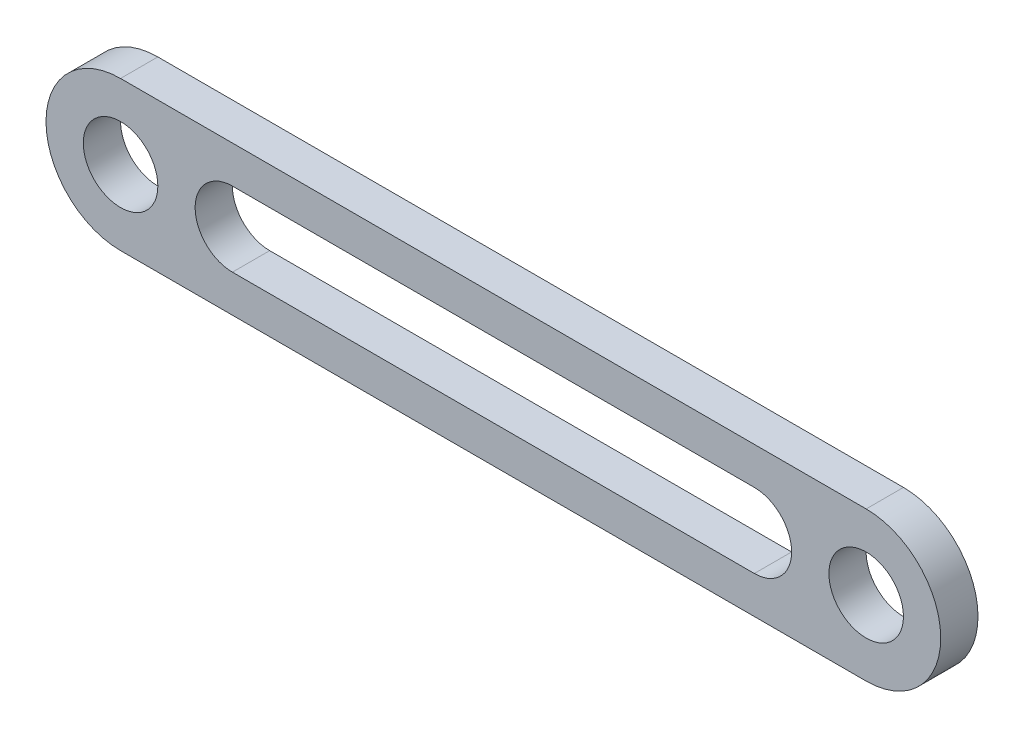
ISO-10303-21;
HEADER;
FILE_DESCRIPTION(('STEP AP214'),'2;1');
FILE_NAME('part.step','',(''),(''),'','','');
FILE_SCHEMA(('AUTOMOTIVE_DESIGN { 1 0 10303 214 1 1 1 1 }'));
ENDSEC;
DATA;
#1=APPLICATION_CONTEXT('core data for automotive mechanical design processes');
#2=APPLICATION_PROTOCOL_DEFINITION('international standard','automotive_design',2000,#1);
#3=PRODUCT_CONTEXT('',#1,'mechanical');
#4=PRODUCT('Part','Part','',(#3));
#5=PRODUCT_RELATED_PRODUCT_CATEGORY('part','',(#4));
#6=PRODUCT_DEFINITION_FORMATION('','',#4);
#7=PRODUCT_DEFINITION_CONTEXT('part definition',#1,'design');
#8=PRODUCT_DEFINITION('design','',#6,#7);
#9=PRODUCT_DEFINITION_SHAPE('','',#8);
#10=(LENGTH_UNIT() NAMED_UNIT(*) SI_UNIT(.MILLI.,.METRE.));
#11=(NAMED_UNIT(*) PLANE_ANGLE_UNIT() SI_UNIT($,.RADIAN.));
#12=(NAMED_UNIT(*) SI_UNIT($,.STERADIAN.) SOLID_ANGLE_UNIT());
#13=UNCERTAINTY_MEASURE_WITH_UNIT(LENGTH_MEASURE(1.E-05),#10,'distance_accuracy_value','');
#14=(GEOMETRIC_REPRESENTATION_CONTEXT(3) GLOBAL_UNCERTAINTY_ASSIGNED_CONTEXT((#13)) GLOBAL_UNIT_ASSIGNED_CONTEXT((#10,
#11,#12)) REPRESENTATION_CONTEXT('',''));
#15=CARTESIAN_POINT('',(0.,0.,0.));
#16=DIRECTION('',(0.,0.,1.));
#17=DIRECTION('',(1.,0.,0.));
#18=AXIS2_PLACEMENT_3D('',#15,#16,#17);
#19=CARTESIAN_POINT('',(-19.4468986928653,3.24412956501815,5.));
#20=DIRECTION('',(0.,0.,-1.));
#21=DIRECTION('',(-1.,0.,0.));
#22=AXIS2_PLACEMENT_3D('',#19,#20,#21);
#23=CYLINDRICAL_SURFACE('',#22,10.);
#24=CARTESIAN_POINT('',(-19.4468986928653,3.24412956501815,0.));
#25=DIRECTION('',(0.,0.,1.));
#26=DIRECTION('',(1.,0.,0.));
#27=AXIS2_PLACEMENT_3D('',#24,#25,#26);
#28=CIRCLE('',#27,10.);
#29=CARTESIAN_POINT('',(-19.2954664246494,-6.75472378264842,0.));
#30=VERTEX_POINT('',#29);
#31=CARTESIAN_POINT('',(-19.4468986928653,13.2441295650181,0.));
#32=VERTEX_POINT('',#31);
#33=EDGE_CURVE('E157',#30,#32,#28,.T.);
#34=ORIENTED_EDGE('',*,*,#33,.T.);
#35=DIRECTION('',(0.,0.,-1.));
#36=VECTOR('',#35,1.);
#37=CARTESIAN_POINT('',(-19.4468986928653,13.2441295650181,5.));
#38=LINE('',#37,#36);
#39=CARTESIAN_POINT('',(-19.4468986928653,13.2441295650181,5.));
#40=VERTEX_POINT('',#39);
#41=EDGE_CURVE('E11',#40,#32,#38,.T.);
#42=ORIENTED_EDGE('',*,*,#41,.F.);
#43=CARTESIAN_POINT('',(-19.4468986928653,3.24412956501815,5.));
#44=DIRECTION('',(0.,0.,1.));
#45=DIRECTION('',(1.,0.,0.));
#46=AXIS2_PLACEMENT_3D('',#43,#44,#45);
#47=CIRCLE('',#46,10.);
#48=CARTESIAN_POINT('',(-19.2954664246494,-6.75472378264842,5.));
#49=VERTEX_POINT('',#48);
#50=EDGE_CURVE('E209',#49,#40,#47,.T.);
#51=ORIENTED_EDGE('',*,*,#50,.F.);
#52=DIRECTION('',(0.,0.,-1.));
#53=VECTOR('',#52,1.);
#54=CARTESIAN_POINT('',(-19.2954664246494,-6.75472378264842,5.));
#55=LINE('',#54,#53);
#56=EDGE_CURVE('E54',#49,#30,#55,.T.);
#57=ORIENTED_EDGE('',*,*,#56,.T.);
#58=EDGE_LOOP('',(#34,#42,#51,#57));
#59=FACE_BOUND('',#58,.T.);
#60=ADVANCED_FACE('F35',(#59),#23,.T.);
#61=CARTESIAN_POINT('',(0.,13.2441295650181,5.));
#62=DIRECTION('',(0.,1.,0.));
#63=DIRECTION('',(0.,0.,1.));
#64=AXIS2_PLACEMENT_3D('',#61,#62,#63);
#65=PLANE('',#64);
#66=DIRECTION('',(1.,0.,0.));
#67=VECTOR('',#66,1.);
#68=CARTESIAN_POINT('',(0.,13.2441295650181,0.));
#69=LINE('',#68,#67);
#70=CARTESIAN_POINT('',(-119.446898692865,13.2441295650181,0.));
#71=VERTEX_POINT('',#70);
#72=EDGE_CURVE('E159',#71,#32,#69,.T.);
#73=ORIENTED_EDGE('',*,*,#72,.F.);
#74=DIRECTION('',(0.,0.,-1.));
#75=VECTOR('',#74,1.);
#76=CARTESIAN_POINT('',(-119.446898692865,13.2441295650181,5.));
#77=LINE('',#76,#75);
#78=CARTESIAN_POINT('',(-119.446898692865,13.2441295650181,5.));
#79=VERTEX_POINT('',#78);
#80=EDGE_CURVE('E45',#79,#71,#77,.T.);
#81=ORIENTED_EDGE('',*,*,#80,.F.);
#82=DIRECTION('',(1.,0.,0.));
#83=VECTOR('',#82,1.);
#84=CARTESIAN_POINT('',(0.,13.2441295650181,5.));
#85=LINE('',#84,#83);
#86=EDGE_CURVE('E121',#79,#40,#85,.T.);
#87=ORIENTED_EDGE('',*,*,#86,.T.);
#88=ORIENTED_EDGE('',*,*,#41,.T.);
#89=EDGE_LOOP('',(#73,#81,#87,#88));
#90=FACE_BOUND('',#89,.T.);
#91=ADVANCED_FACE('F212',(#90),#65,.T.);
#92=CARTESIAN_POINT('',(-119.446898692865,3.24412956501815,5.));
#93=DIRECTION('',(0.,0.,-1.));
#94=DIRECTION('',(-1.,0.,0.));
#95=AXIS2_PLACEMENT_3D('',#92,#93,#94);
#96=CYLINDRICAL_SURFACE('',#95,10.);
#97=CARTESIAN_POINT('',(-119.446898692865,3.24412956501815,0.));
#98=DIRECTION('',(0.,0.,1.));
#99=DIRECTION('',(1.,0.,0.));
#100=AXIS2_PLACEMENT_3D('',#97,#98,#99);
#101=CIRCLE('',#100,10.);
#102=CARTESIAN_POINT('',(-119.446898692865,-6.75587043498185,0.));
#103=VERTEX_POINT('',#102);
#104=EDGE_CURVE('E128',#71,#103,#101,.T.);
#105=ORIENTED_EDGE('',*,*,#104,.T.);
#106=DIRECTION('',(0.,0.,-1.));
#107=VECTOR('',#106,1.);
#108=CARTESIAN_POINT('',(-119.446898692865,-6.75587043498185,5.));
#109=LINE('',#108,#107);
#110=CARTESIAN_POINT('',(-119.446898692865,-6.75587043498185,5.));
#111=VERTEX_POINT('',#110);
#112=EDGE_CURVE('E125',#111,#103,#109,.T.);
#113=ORIENTED_EDGE('',*,*,#112,.F.);
#114=CARTESIAN_POINT('',(-119.446898692865,3.24412956501815,5.));
#115=DIRECTION('',(0.,0.,1.));
#116=DIRECTION('',(1.,0.,0.));
#117=AXIS2_PLACEMENT_3D('',#114,#115,#116);
#118=CIRCLE('',#117,10.);
#119=EDGE_CURVE('E114',#79,#111,#118,.T.);
#120=ORIENTED_EDGE('',*,*,#119,.F.);
#121=ORIENTED_EDGE('',*,*,#80,.T.);
#122=EDGE_LOOP('',(#105,#113,#120,#121));
#123=FACE_BOUND('',#122,.T.);
#124=ADVANCED_FACE('F126',(#123),#96,.T.);
#125=CARTESIAN_POINT('',(0.,-6.75587043498185,5.));
#126=DIRECTION('',(0.,1.,0.));
#127=DIRECTION('',(0.,0.,1.));
#128=AXIS2_PLACEMENT_3D('',#125,#126,#127);
#129=PLANE('',#128);
#130=DIRECTION('',(1.,0.,0.));
#131=VECTOR('',#130,1.);
#132=CARTESIAN_POINT('',(0.,-6.75587043498185,0.));
#133=LINE('',#132,#131);
#134=CARTESIAN_POINT('',(-19.2954664246494,-6.75587043498185,0.));
#135=VERTEX_POINT('',#134);
#136=EDGE_CURVE('E163',#103,#135,#133,.T.);
#137=ORIENTED_EDGE('',*,*,#136,.T.);
#138=DIRECTION('',(0.,0.,-1.));
#139=VECTOR('',#138,1.);
#140=CARTESIAN_POINT('',(-19.2954664246494,-6.75587043498185,5.));
#141=LINE('',#140,#139);
#142=CARTESIAN_POINT('',(-19.2954664246494,-6.75587043498185,5.));
#143=VERTEX_POINT('',#142);
#144=EDGE_CURVE('E83',#143,#135,#141,.T.);
#145=ORIENTED_EDGE('',*,*,#144,.F.);
#146=DIRECTION('',(1.,0.,0.));
#147=VECTOR('',#146,1.);
#148=CARTESIAN_POINT('',(0.,-6.75587043498185,5.));
#149=LINE('',#148,#147);
#150=EDGE_CURVE('E119',#111,#143,#149,.T.);
#151=ORIENTED_EDGE('',*,*,#150,.F.);
#152=ORIENTED_EDGE('',*,*,#112,.T.);
#153=EDGE_LOOP('',(#137,#145,#151,#152));
#154=FACE_BOUND('',#153,.T.);
#155=ADVANCED_FACE('F132',(#154),#129,.F.);
#156=CARTESIAN_POINT('',(-34.4468986928653,3.24412956501815,5.));
#157=DIRECTION('',(0.,0.,-1.));
#158=DIRECTION('',(-1.,0.,0.));
#159=AXIS2_PLACEMENT_3D('',#156,#157,#158);
#160=CYLINDRICAL_SURFACE('',#159,5.);
#161=CARTESIAN_POINT('',(-34.4468986928653,3.24412956501815,0.));
#162=DIRECTION('',(0.,0.,1.));
#163=DIRECTION('',(1.,0.,0.));
#164=AXIS2_PLACEMENT_3D('',#161,#162,#163);
#165=CIRCLE('',#164,5.);
#166=CARTESIAN_POINT('',(-34.4468986928653,-1.75587043498186,0.));
#167=VERTEX_POINT('',#166);
#168=CARTESIAN_POINT('',(-34.4468986928653,8.24412956501815,0.));
#169=VERTEX_POINT('',#168);
#170=EDGE_CURVE('E139',#167,#169,#165,.T.);
#171=ORIENTED_EDGE('',*,*,#170,.F.);
#172=DIRECTION('',(0.,0.,-1.));
#173=VECTOR('',#172,1.);
#174=CARTESIAN_POINT('',(-34.4468986928653,-1.75587043498186,5.));
#175=LINE('',#174,#173);
#176=CARTESIAN_POINT('',(-34.4468986928653,-1.75587043498186,5.));
#177=VERTEX_POINT('',#176);
#178=EDGE_CURVE('E39',#177,#167,#175,.T.);
#179=ORIENTED_EDGE('',*,*,#178,.F.);
#180=CARTESIAN_POINT('',(-34.4468986928653,3.24412956501815,5.));
#181=DIRECTION('',(0.,0.,1.));
#182=DIRECTION('',(1.,0.,0.));
#183=AXIS2_PLACEMENT_3D('',#180,#181,#182);
#184=CIRCLE('',#183,5.);
#185=CARTESIAN_POINT('',(-34.4468986928653,8.24412956501815,5.));
#186=VERTEX_POINT('',#185);
#187=EDGE_CURVE('E168',#177,#186,#184,.T.);
#188=ORIENTED_EDGE('',*,*,#187,.T.);
#189=DIRECTION('',(0.,0.,-1.));
#190=VECTOR('',#189,1.);
#191=CARTESIAN_POINT('',(-34.4468986928653,8.24412956501815,5.));
#192=LINE('',#191,#190);
#193=EDGE_CURVE('E135',#186,#169,#192,.T.);
#194=ORIENTED_EDGE('',*,*,#193,.T.);
#195=EDGE_LOOP('',(#171,#179,#188,#194));
#196=FACE_BOUND('',#195,.T.);
#197=ADVANCED_FACE('F37',(#196),#160,.F.);
#198=CARTESIAN_POINT('',(0.,-1.75587043498186,5.));
#199=DIRECTION('',(0.,1.,0.));
#200=DIRECTION('',(0.,0.,1.));
#201=AXIS2_PLACEMENT_3D('',#198,#199,#200);
#202=PLANE('',#201);
#203=DIRECTION('',(1.,0.,0.));
#204=VECTOR('',#203,1.);
#205=CARTESIAN_POINT('',(0.,-1.75587043498186,0.));
#206=LINE('',#205,#204);
#207=CARTESIAN_POINT('',(-104.446898692865,-1.75587043498186,0.));
#208=VERTEX_POINT('',#207);
#209=EDGE_CURVE('E142',#208,#167,#206,.T.);
#210=ORIENTED_EDGE('',*,*,#209,.F.);
#211=DIRECTION('',(0.,0.,-1.));
#212=VECTOR('',#211,1.);
#213=CARTESIAN_POINT('',(-104.446898692865,-1.75587043498186,5.));
#214=LINE('',#213,#212);
#215=CARTESIAN_POINT('',(-104.446898692865,-1.75587043498186,5.));
#216=VERTEX_POINT('',#215);
#217=EDGE_CURVE('E174',#216,#208,#214,.T.);
#218=ORIENTED_EDGE('',*,*,#217,.F.);
#219=DIRECTION('',(1.,0.,0.));
#220=VECTOR('',#219,1.);
#221=CARTESIAN_POINT('',(0.,-1.75587043498186,5.));
#222=LINE('',#221,#220);
#223=EDGE_CURVE('E183',#216,#177,#222,.T.);
#224=ORIENTED_EDGE('',*,*,#223,.T.);
#225=ORIENTED_EDGE('',*,*,#178,.T.);
#226=EDGE_LOOP('',(#210,#218,#224,#225));
#227=FACE_BOUND('',#226,.T.);
#228=ADVANCED_FACE('F181',(#227),#202,.T.);
#229=CARTESIAN_POINT('',(-104.446898692865,3.24412956501815,5.));
#230=DIRECTION('',(0.,0.,-1.));
#231=DIRECTION('',(-1.,0.,0.));
#232=AXIS2_PLACEMENT_3D('',#229,#230,#231);
#233=CYLINDRICAL_SURFACE('',#232,5.);
#234=CARTESIAN_POINT('',(-104.446898692865,3.24412956501815,0.));
#235=DIRECTION('',(0.,0.,1.));
#236=DIRECTION('',(1.,0.,0.));
#237=AXIS2_PLACEMENT_3D('',#234,#235,#236);
#238=CIRCLE('',#237,5.);
#239=CARTESIAN_POINT('',(-104.446898692865,8.24412956501815,0.));
#240=VERTEX_POINT('',#239);
#241=EDGE_CURVE('E145',#240,#208,#238,.T.);
#242=ORIENTED_EDGE('',*,*,#241,.F.);
#243=DIRECTION('',(0.,0.,-1.));
#244=VECTOR('',#243,1.);
#245=CARTESIAN_POINT('',(-104.446898692865,8.24412956501815,5.));
#246=LINE('',#245,#244);
#247=CARTESIAN_POINT('',(-104.446898692865,8.24412956501815,5.));
#248=VERTEX_POINT('',#247);
#249=EDGE_CURVE('E173',#248,#240,#246,.T.);
#250=ORIENTED_EDGE('',*,*,#249,.F.);
#251=CARTESIAN_POINT('',(-104.446898692865,3.24412956501815,5.));
#252=DIRECTION('',(0.,0.,1.));
#253=DIRECTION('',(1.,0.,0.));
#254=AXIS2_PLACEMENT_3D('',#251,#252,#253);
#255=CIRCLE('',#254,5.);
#256=EDGE_CURVE('E192',#248,#216,#255,.T.);
#257=ORIENTED_EDGE('',*,*,#256,.T.);
#258=ORIENTED_EDGE('',*,*,#217,.T.);
#259=EDGE_LOOP('',(#242,#250,#257,#258));
#260=FACE_BOUND('',#259,.T.);
#261=ADVANCED_FACE('F189',(#260),#233,.F.);
#262=CARTESIAN_POINT('',(-19.4468986928653,3.24412956501815,5.));
#263=DIRECTION('',(0.,0.,-1.));
#264=DIRECTION('',(-1.,0.,0.));
#265=AXIS2_PLACEMENT_3D('',#262,#263,#264);
#266=CYLINDRICAL_SURFACE('',#265,5.);
#267=CARTESIAN_POINT('',(-19.4468986928653,3.24412956501815,5.));
#268=DIRECTION('',(0.,0.,1.));
#269=DIRECTION('',(1.,0.,0.));
#270=AXIS2_PLACEMENT_3D('',#267,#268,#269);
#271=CIRCLE('',#270,5.);
#272=CARTESIAN_POINT('',(-14.4468986928653,3.24412956501815,5.));
#273=VERTEX_POINT('',#272);
#274=EDGE_CURVE('E206',#273,#273,#271,.T.);
#275=ORIENTED_EDGE('',*,*,#274,.T.);
#276=EDGE_LOOP('',(#275));
#277=FACE_BOUND('',#276,.T.);
#278=CARTESIAN_POINT('',(-19.4468986928653,3.24412956501815,0.));
#279=DIRECTION('',(0.,0.,1.));
#280=DIRECTION('',(1.,0.,0.));
#281=AXIS2_PLACEMENT_3D('',#278,#279,#280);
#282=CIRCLE('',#281,5.);
#283=CARTESIAN_POINT('',(-14.4468986928653,3.24412956501815,0.));
#284=VERTEX_POINT('',#283);
#285=EDGE_CURVE('E154',#284,#284,#282,.T.);
#286=ORIENTED_EDGE('',*,*,#285,.F.);
#287=EDGE_LOOP('',(#286));
#288=FACE_BOUND('',#287,.T.);
#289=ADVANCED_FACE('F235',(#277,#288),#266,.F.);
#290=CARTESIAN_POINT('',(-119.446898692865,3.24412956501815,5.));
#291=DIRECTION('',(0.,0.,-1.));
#292=DIRECTION('',(-1.,0.,0.));
#293=AXIS2_PLACEMENT_3D('',#290,#291,#292);
#294=CYLINDRICAL_SURFACE('',#293,5.);
#295=CARTESIAN_POINT('',(-119.446898692865,3.24412956501815,5.));
#296=DIRECTION('',(0.,0.,1.));
#297=DIRECTION('',(1.,0.,0.));
#298=AXIS2_PLACEMENT_3D('',#295,#296,#297);
#299=CIRCLE('',#298,5.);
#300=CARTESIAN_POINT('',(-114.446898692865,3.24412956501815,5.));
#301=VERTEX_POINT('',#300);
#302=EDGE_CURVE('E197',#301,#301,#299,.T.);
#303=ORIENTED_EDGE('',*,*,#302,.T.);
#304=EDGE_LOOP('',(#303));
#305=FACE_BOUND('',#304,.T.);
#306=CARTESIAN_POINT('',(-119.446898692865,3.24412956501815,0.));
#307=DIRECTION('',(0.,0.,1.));
#308=DIRECTION('',(1.,0.,0.));
#309=AXIS2_PLACEMENT_3D('',#306,#307,#308);
#310=CIRCLE('',#309,5.);
#311=CARTESIAN_POINT('',(-114.446898692865,3.24412956501815,0.));
#312=VERTEX_POINT('',#311);
#313=EDGE_CURVE('E151',#312,#312,#310,.T.);
#314=ORIENTED_EDGE('',*,*,#313,.F.);
#315=EDGE_LOOP('',(#314));
#316=FACE_BOUND('',#315,.T.);
#317=ADVANCED_FACE('F223',(#305,#316),#294,.F.);
#318=CARTESIAN_POINT('',(0.,8.24412956501815,5.));
#319=DIRECTION('',(0.,1.,0.));
#320=DIRECTION('',(0.,0.,1.));
#321=AXIS2_PLACEMENT_3D('',#318,#319,#320);
#322=PLANE('',#321);
#323=DIRECTION('',(1.,0.,0.));
#324=VECTOR('',#323,1.);
#325=CARTESIAN_POINT('',(0.,8.24412956501815,0.));
#326=LINE('',#325,#324);
#327=EDGE_CURVE('E148',#240,#169,#326,.T.);
#328=ORIENTED_EDGE('',*,*,#327,.T.);
#329=ORIENTED_EDGE('',*,*,#193,.F.);
#330=DIRECTION('',(1.,0.,0.));
#331=VECTOR('',#330,1.);
#332=CARTESIAN_POINT('',(0.,8.24412956501815,5.));
#333=LINE('',#332,#331);
#334=EDGE_CURVE('E194',#248,#186,#333,.T.);
#335=ORIENTED_EDGE('',*,*,#334,.F.);
#336=ORIENTED_EDGE('',*,*,#249,.T.);
#337=EDGE_LOOP('',(#328,#329,#335,#336));
#338=FACE_BOUND('',#337,.T.);
#339=ADVANCED_FACE('F195',(#338),#322,.F.);
#340=CARTESIAN_POINT('',(-19.2954664246494,0.,5.));
#341=DIRECTION('',(1.,0.,0.));
#342=DIRECTION('',(0.,0.,-1.));
#343=AXIS2_PLACEMENT_3D('',#340,#341,#342);
#344=PLANE('',#343);
#345=DIRECTION('',(0.,-1.,0.));
#346=VECTOR('',#345,1.);
#347=CARTESIAN_POINT('',(-19.2954664246494,0.,0.));
#348=LINE('',#347,#346);
#349=EDGE_CURVE('E165',#30,#135,#348,.T.);
#350=ORIENTED_EDGE('',*,*,#349,.F.);
#351=ORIENTED_EDGE('',*,*,#56,.F.);
#352=DIRECTION('',(0.,-1.,0.));
#353=VECTOR('',#352,1.);
#354=CARTESIAN_POINT('',(-19.2954664246494,0.,5.));
#355=LINE('',#354,#353);
#356=EDGE_CURVE('E133',#49,#143,#355,.T.);
#357=ORIENTED_EDGE('',*,*,#356,.T.);
#358=ORIENTED_EDGE('',*,*,#144,.T.);
#359=EDGE_LOOP('',(#350,#351,#357,#358));
#360=FACE_BOUND('',#359,.T.);
#361=ADVANCED_FACE('F215',(#360),#344,.T.);
#362=CARTESIAN_POINT('',(0.,0.,5.));
#363=DIRECTION('',(0.,0.,1.));
#364=DIRECTION('',(1.,0.,0.));
#365=AXIS2_PLACEMENT_3D('',#362,#363,#364);
#366=PLANE('',#365);
#367=ORIENTED_EDGE('',*,*,#187,.F.);
#368=ORIENTED_EDGE('',*,*,#223,.F.);
#369=ORIENTED_EDGE('',*,*,#256,.F.);
#370=ORIENTED_EDGE('',*,*,#334,.T.);
#371=EDGE_LOOP('',(#367,#368,#369,#370));
#372=FACE_BOUND('',#371,.T.);
#373=ORIENTED_EDGE('',*,*,#302,.F.);
#374=EDGE_LOOP('',(#373));
#375=FACE_BOUND('',#374,.T.);
#376=ORIENTED_EDGE('',*,*,#274,.F.);
#377=EDGE_LOOP('',(#376));
#378=FACE_BOUND('',#377,.T.);
#379=ORIENTED_EDGE('',*,*,#50,.T.);
#380=ORIENTED_EDGE('',*,*,#86,.F.);
#381=ORIENTED_EDGE('',*,*,#119,.T.);
#382=ORIENTED_EDGE('',*,*,#150,.T.);
#383=ORIENTED_EDGE('',*,*,#356,.F.);
#384=EDGE_LOOP('',(#379,#380,#381,#382,#383));
#385=FACE_BOUND('',#384,.T.);
#386=ADVANCED_FACE('F116',(#372,#375,#378,#385),#366,.T.);
#387=CARTESIAN_POINT('',(0.,0.,0.));
#388=DIRECTION('',(0.,0.,1.));
#389=DIRECTION('',(1.,0.,0.));
#390=AXIS2_PLACEMENT_3D('',#387,#388,#389);
#391=PLANE('',#390);
#392=ORIENTED_EDGE('',*,*,#170,.T.);
#393=ORIENTED_EDGE('',*,*,#327,.F.);
#394=ORIENTED_EDGE('',*,*,#241,.T.);
#395=ORIENTED_EDGE('',*,*,#209,.T.);
#396=EDGE_LOOP('',(#392,#393,#394,#395));
#397=FACE_BOUND('',#396,.T.);
#398=ORIENTED_EDGE('',*,*,#313,.T.);
#399=EDGE_LOOP('',(#398));
#400=FACE_BOUND('',#399,.T.);
#401=ORIENTED_EDGE('',*,*,#285,.T.);
#402=EDGE_LOOP('',(#401));
#403=FACE_BOUND('',#402,.T.);
#404=ORIENTED_EDGE('',*,*,#33,.F.);
#405=ORIENTED_EDGE('',*,*,#349,.T.);
#406=ORIENTED_EDGE('',*,*,#136,.F.);
#407=ORIENTED_EDGE('',*,*,#104,.F.);
#408=ORIENTED_EDGE('',*,*,#72,.T.);
#409=EDGE_LOOP('',(#404,#405,#406,#407,#408));
#410=FACE_BOUND('',#409,.T.);
#411=ADVANCED_FACE('F187',(#397,#400,#403,#410),#391,.F.);
#412=CLOSED_SHELL('',(#60,#91,#124,#155,#197,#228,#261,#289,#317,#339,#361,#386,#411));
#413=MANIFOLD_SOLID_BREP('B2',#412);
#414=ADVANCED_BREP_SHAPE_REPRESENTATION('',(#18,#413),#14);
#415=SHAPE_DEFINITION_REPRESENTATION(#9,#414);
ENDSEC;
END-ISO-10303-21;
